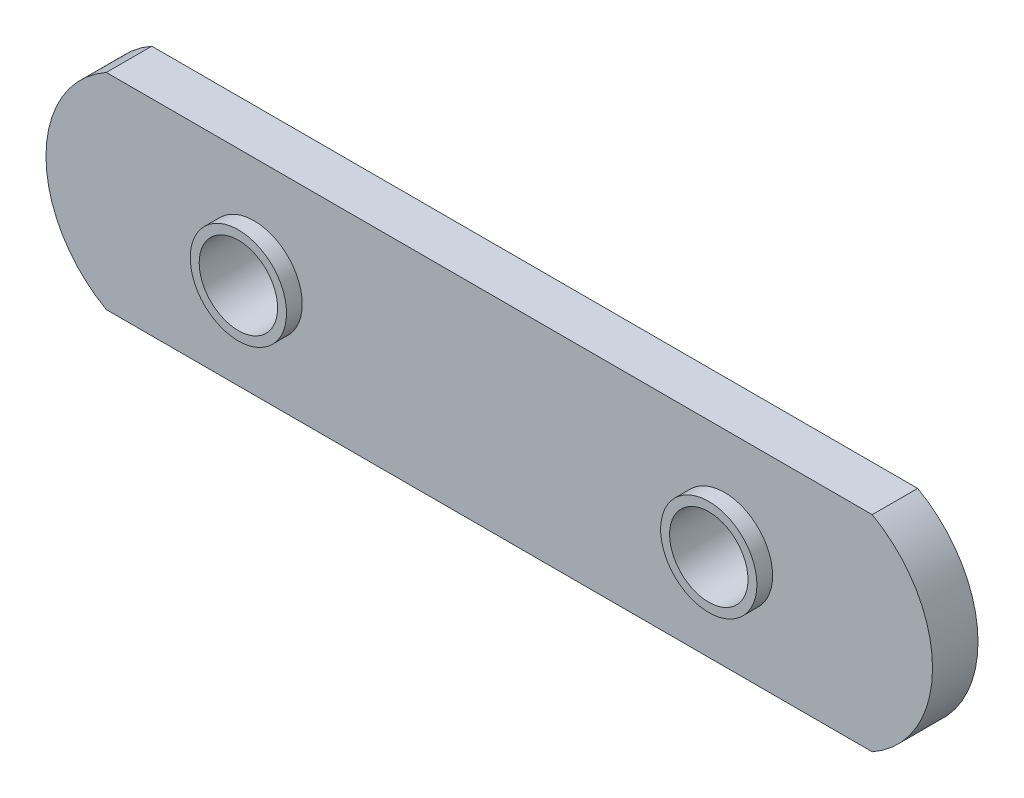
ISO-10303-21;
HEADER;
FILE_DESCRIPTION(('STEP AP214'),'2;1');
FILE_NAME('part.step','',(''),(''),'','','');
FILE_SCHEMA(('AUTOMOTIVE_DESIGN { 1 0 10303 214 1 1 1 1 }'));
ENDSEC;
DATA;
#1=APPLICATION_CONTEXT('core data for automotive mechanical design processes');
#2=APPLICATION_PROTOCOL_DEFINITION('international standard','automotive_design',2000,#1);
#3=PRODUCT_CONTEXT('',#1,'mechanical');
#4=PRODUCT('Part','Part','',(#3));
#5=PRODUCT_RELATED_PRODUCT_CATEGORY('part','',(#4));
#6=PRODUCT_DEFINITION_FORMATION('','',#4);
#7=PRODUCT_DEFINITION_CONTEXT('part definition',#1,'design');
#8=PRODUCT_DEFINITION('design','',#6,#7);
#9=PRODUCT_DEFINITION_SHAPE('','',#8);
#10=(LENGTH_UNIT() NAMED_UNIT(*) SI_UNIT(.MILLI.,.METRE.));
#11=(NAMED_UNIT(*) PLANE_ANGLE_UNIT() SI_UNIT($,.RADIAN.));
#12=(NAMED_UNIT(*) SI_UNIT($,.STERADIAN.) SOLID_ANGLE_UNIT());
#13=UNCERTAINTY_MEASURE_WITH_UNIT(LENGTH_MEASURE(1.E-05),#10,'distance_accuracy_value','');
#14=(GEOMETRIC_REPRESENTATION_CONTEXT(3) GLOBAL_UNCERTAINTY_ASSIGNED_CONTEXT((#13)) GLOBAL_UNIT_ASSIGNED_CONTEXT((#10,
#11,#12)) REPRESENTATION_CONTEXT('',''));
#15=CARTESIAN_POINT('',(0.,0.,0.));
#16=DIRECTION('',(0.,0.,1.));
#17=DIRECTION('',(1.,0.,0.));
#18=AXIS2_PLACEMENT_3D('',#15,#16,#17);
#19=CARTESIAN_POINT('',(-26.3779,0.,1.8415));
#20=DIRECTION('',(0.,0.,1.));
#21=DIRECTION('',(1.,0.,0.));
#22=AXIS2_PLACEMENT_3D('',#19,#20,#21);
#23=PLANE('',#22);
#24=CARTESIAN_POINT('',(19.05,0.,1.8415));
#25=DIRECTION('',(0.,0.,1.));
#26=DIRECTION('',(1.,0.,0.));
#27=AXIS2_PLACEMENT_3D('',#24,#25,#26);
#28=CIRCLE('',#27,3.8989);
#29=CARTESIAN_POINT('',(22.9489,0.,1.8415));
#30=VERTEX_POINT('',#29);
#31=EDGE_CURVE('E117',#30,#30,#28,.T.);
#32=ORIENTED_EDGE('',*,*,#31,.F.);
#33=EDGE_LOOP('',(#32));
#34=FACE_BOUND('',#33,.T.);
#35=CARTESIAN_POINT('',(-26.3779,0.,1.8415));
#36=DIRECTION('',(0.,0.,1.));
#37=DIRECTION('',(1.,0.,0.));
#38=AXIS2_PLACEMENT_3D('',#35,#36,#37);
#39=CIRCLE('',#38,9.525);
#40=CARTESIAN_POINT('',(-31.0177472765814,8.31849999999999,1.8415));
#41=VERTEX_POINT('',#40);
#42=CARTESIAN_POINT('',(-31.0177472765814,-8.31850000000001,1.8415));
#43=VERTEX_POINT('',#42);
#44=EDGE_CURVE('E90',#41,#43,#39,.T.);
#45=ORIENTED_EDGE('',*,*,#44,.T.);
#46=DIRECTION('',(1.,0.,0.));
#47=VECTOR('',#46,1.);
#48=CARTESIAN_POINT('',(31.0177472765814,-8.31850000000001,1.8415));
#49=LINE('',#48,#47);
#50=CARTESIAN_POINT('',(31.0177472765814,-8.31850000000001,1.8415));
#51=VERTEX_POINT('',#50);
#52=EDGE_CURVE('E85',#43,#51,#49,.T.);
#53=ORIENTED_EDGE('',*,*,#52,.T.);
#54=CARTESIAN_POINT('',(26.3779,0.,1.8415));
#55=DIRECTION('',(0.,0.,1.));
#56=DIRECTION('',(1.,0.,0.));
#57=AXIS2_PLACEMENT_3D('',#54,#55,#56);
#58=CIRCLE('',#57,9.525);
#59=CARTESIAN_POINT('',(31.0177472765814,8.31849999999999,1.8415));
#60=VERTEX_POINT('',#59);
#61=EDGE_CURVE('E88',#51,#60,#58,.T.);
#62=ORIENTED_EDGE('',*,*,#61,.T.);
#63=DIRECTION('',(-1.,0.,0.));
#64=VECTOR('',#63,1.);
#65=CARTESIAN_POINT('',(-31.0177472765814,8.31849999999999,1.8415));
#66=LINE('',#65,#64);
#67=EDGE_CURVE('E55',#60,#41,#66,.T.);
#68=ORIENTED_EDGE('',*,*,#67,.T.);
#69=EDGE_LOOP('',(#45,#53,#62,#68));
#70=FACE_BOUND('',#69,.T.);
#71=CARTESIAN_POINT('',(-19.05,0.,1.8415));
#72=DIRECTION('',(0.,0.,1.));
#73=DIRECTION('',(1.,0.,0.));
#74=AXIS2_PLACEMENT_3D('',#71,#72,#73);
#75=CIRCLE('',#74,3.8989);
#76=CARTESIAN_POINT('',(-15.1511,0.,1.8415));
#77=VERTEX_POINT('',#76);
#78=EDGE_CURVE('E123',#77,#77,#75,.T.);
#79=ORIENTED_EDGE('',*,*,#78,.F.);
#80=EDGE_LOOP('',(#79));
#81=FACE_BOUND('',#80,.T.);
#82=ADVANCED_FACE('F37',(#34,#70,#81),#23,.T.);
#83=CARTESIAN_POINT('',(-26.3779,0.,1.8415));
#84=DIRECTION('',(0.,0.,-1.));
#85=DIRECTION('',(-1.,0.,0.));
#86=AXIS2_PLACEMENT_3D('',#83,#84,#85);
#87=CYLINDRICAL_SURFACE('',#86,9.525);
#88=CARTESIAN_POINT('',(-26.3779,0.,-1.8415));
#89=DIRECTION('',(0.,0.,1.));
#90=DIRECTION('',(1.,0.,0.));
#91=AXIS2_PLACEMENT_3D('',#88,#89,#90);
#92=CIRCLE('',#91,9.525);
#93=CARTESIAN_POINT('',(-31.0177472765814,8.31849999999999,-1.8415));
#94=VERTEX_POINT('',#93);
#95=CARTESIAN_POINT('',(-31.0177472765814,-8.31850000000001,-1.8415));
#96=VERTEX_POINT('',#95);
#97=EDGE_CURVE('E103',#94,#96,#92,.T.);
#98=ORIENTED_EDGE('',*,*,#97,.T.);
#99=DIRECTION('',(0.,0.,-1.));
#100=VECTOR('',#99,1.);
#101=CARTESIAN_POINT('',(-31.0177472765814,-8.31850000000001,1.8415));
#102=LINE('',#101,#100);
#103=EDGE_CURVE('E11',#43,#96,#102,.T.);
#104=ORIENTED_EDGE('',*,*,#103,.F.);
#105=ORIENTED_EDGE('',*,*,#44,.F.);
#106=DIRECTION('',(0.,0.,-1.));
#107=VECTOR('',#106,1.);
#108=CARTESIAN_POINT('',(-31.0177472765814,8.31849999999999,1.8415));
#109=LINE('',#108,#107);
#110=EDGE_CURVE('E99',#41,#94,#109,.T.);
#111=ORIENTED_EDGE('',*,*,#110,.T.);
#112=EDGE_LOOP('',(#98,#104,#105,#111));
#113=FACE_BOUND('',#112,.T.);
#114=ADVANCED_FACE('F39',(#113),#87,.T.);
#115=CARTESIAN_POINT('',(31.0177472765814,-8.31850000000001,1.8415));
#116=DIRECTION('',(0.,1.,0.));
#117=DIRECTION('',(0.,0.,1.));
#118=AXIS2_PLACEMENT_3D('',#115,#116,#117);
#119=PLANE('',#118);
#120=DIRECTION('',(1.,0.,0.));
#121=VECTOR('',#120,1.);
#122=CARTESIAN_POINT('',(31.0177472765814,-8.31850000000001,-1.8415));
#123=LINE('',#122,#121);
#124=CARTESIAN_POINT('',(31.0177472765814,-8.31850000000001,-1.8415));
#125=VERTEX_POINT('',#124);
#126=EDGE_CURVE('E94',#96,#125,#123,.T.);
#127=ORIENTED_EDGE('',*,*,#126,.T.);
#128=DIRECTION('',(0.,0.,-1.));
#129=VECTOR('',#128,1.);
#130=CARTESIAN_POINT('',(31.0177472765814,-8.31850000000001,1.8415));
#131=LINE('',#130,#129);
#132=EDGE_CURVE('E47',#51,#125,#131,.T.);
#133=ORIENTED_EDGE('',*,*,#132,.F.);
#134=ORIENTED_EDGE('',*,*,#52,.F.);
#135=ORIENTED_EDGE('',*,*,#103,.T.);
#136=EDGE_LOOP('',(#127,#133,#134,#135));
#137=FACE_BOUND('',#136,.T.);
#138=ADVANCED_FACE('F93',(#137),#119,.F.);
#139=CARTESIAN_POINT('',(26.3779,0.,1.8415));
#140=DIRECTION('',(0.,0.,-1.));
#141=DIRECTION('',(-1.,0.,0.));
#142=AXIS2_PLACEMENT_3D('',#139,#140,#141);
#143=CYLINDRICAL_SURFACE('',#142,9.525);
#144=CARTESIAN_POINT('',(26.3779,0.,-1.8415));
#145=DIRECTION('',(0.,0.,1.));
#146=DIRECTION('',(1.,0.,0.));
#147=AXIS2_PLACEMENT_3D('',#144,#145,#146);
#148=CIRCLE('',#147,9.525);
#149=CARTESIAN_POINT('',(31.0177472765814,8.31849999999999,-1.8415));
#150=VERTEX_POINT('',#149);
#151=EDGE_CURVE('E72',#125,#150,#148,.T.);
#152=ORIENTED_EDGE('',*,*,#151,.T.);
#153=DIRECTION('',(0.,0.,-1.));
#154=VECTOR('',#153,1.);
#155=CARTESIAN_POINT('',(31.0177472765814,8.31849999999999,1.8415));
#156=LINE('',#155,#154);
#157=EDGE_CURVE('E95',#60,#150,#156,.T.);
#158=ORIENTED_EDGE('',*,*,#157,.F.);
#159=ORIENTED_EDGE('',*,*,#61,.F.);
#160=ORIENTED_EDGE('',*,*,#132,.T.);
#161=EDGE_LOOP('',(#152,#158,#159,#160));
#162=FACE_BOUND('',#161,.T.);
#163=ADVANCED_FACE('F97',(#162),#143,.T.);
#164=CARTESIAN_POINT('',(-31.0177472765814,8.31849999999999,1.8415));
#165=DIRECTION('',(0.,-1.,0.));
#166=DIRECTION('',(0.,0.,-1.));
#167=AXIS2_PLACEMENT_3D('',#164,#165,#166);
#168=PLANE('',#167);
#169=DIRECTION('',(-1.,0.,0.));
#170=VECTOR('',#169,1.);
#171=CARTESIAN_POINT('',(-31.0177472765814,8.31849999999999,-1.8415));
#172=LINE('',#171,#170);
#173=EDGE_CURVE('E78',#150,#94,#172,.T.);
#174=ORIENTED_EDGE('',*,*,#173,.T.);
#175=ORIENTED_EDGE('',*,*,#110,.F.);
#176=ORIENTED_EDGE('',*,*,#67,.F.);
#177=ORIENTED_EDGE('',*,*,#157,.T.);
#178=EDGE_LOOP('',(#174,#175,#176,#177));
#179=FACE_BOUND('',#178,.T.);
#180=ADVANCED_FACE('F111',(#179),#168,.F.);
#181=CARTESIAN_POINT('',(-26.3779,0.,-1.8415));
#182=DIRECTION('',(0.,0.,1.));
#183=DIRECTION('',(1.,0.,0.));
#184=AXIS2_PLACEMENT_3D('',#181,#182,#183);
#185=PLANE('',#184);
#186=CARTESIAN_POINT('',(-19.05,0.,-1.8415));
#187=DIRECTION('',(0.,0.,-1.));
#188=DIRECTION('',(-1.,0.,0.));
#189=AXIS2_PLACEMENT_3D('',#186,#187,#188);
#190=CIRCLE('',#189,3.175);
#191=CARTESIAN_POINT('',(-22.225,0.,-1.8415));
#192=VERTEX_POINT('',#191);
#193=EDGE_CURVE('E134',#192,#192,#190,.T.);
#194=ORIENTED_EDGE('',*,*,#193,.F.);
#195=EDGE_LOOP('',(#194));
#196=FACE_BOUND('',#195,.T.);
#197=CARTESIAN_POINT('',(19.05,0.,-1.8415));
#198=DIRECTION('',(0.,0.,-1.));
#199=DIRECTION('',(-1.,0.,0.));
#200=AXIS2_PLACEMENT_3D('',#197,#198,#199);
#201=CIRCLE('',#200,3.175);
#202=CARTESIAN_POINT('',(15.875,0.,-1.8415));
#203=VERTEX_POINT('',#202);
#204=EDGE_CURVE('E128',#203,#203,#201,.T.);
#205=ORIENTED_EDGE('',*,*,#204,.F.);
#206=EDGE_LOOP('',(#205));
#207=FACE_BOUND('',#206,.T.);
#208=ORIENTED_EDGE('',*,*,#97,.F.);
#209=ORIENTED_EDGE('',*,*,#173,.F.);
#210=ORIENTED_EDGE('',*,*,#151,.F.);
#211=ORIENTED_EDGE('',*,*,#126,.F.);
#212=EDGE_LOOP('',(#208,#209,#210,#211));
#213=FACE_BOUND('',#212,.T.);
#214=ADVANCED_FACE('F114',(#196,#207,#213),#185,.F.);
#215=CARTESIAN_POINT('',(19.05,0.,3.1115));
#216=DIRECTION('',(0.,0.,-1.));
#217=DIRECTION('',(-1.,0.,0.));
#218=AXIS2_PLACEMENT_3D('',#215,#216,#217);
#219=CYLINDRICAL_SURFACE('',#218,3.8989);
#220=CARTESIAN_POINT('',(19.05,0.,3.1115));
#221=DIRECTION('',(0.,0.,1.));
#222=DIRECTION('',(1.,0.,0.));
#223=AXIS2_PLACEMENT_3D('',#220,#221,#222);
#224=CIRCLE('',#223,3.8989);
#225=CARTESIAN_POINT('',(22.9489,0.,3.1115));
#226=VERTEX_POINT('',#225);
#227=EDGE_CURVE('E106',#226,#226,#224,.T.);
#228=ORIENTED_EDGE('',*,*,#227,.F.);
#229=EDGE_LOOP('',(#228));
#230=FACE_BOUND('',#229,.T.);
#231=ORIENTED_EDGE('',*,*,#31,.T.);
#232=EDGE_LOOP('',(#231));
#233=FACE_BOUND('',#232,.T.);
#234=ADVANCED_FACE('F142',(#230,#233),#219,.T.);
#235=CARTESIAN_POINT('',(19.05,0.,3.1115));
#236=DIRECTION('',(0.,0.,1.));
#237=DIRECTION('',(1.,0.,0.));
#238=AXIS2_PLACEMENT_3D('',#235,#236,#237);
#239=PLANE('',#238);
#240=CARTESIAN_POINT('',(19.05,0.,3.1115));
#241=DIRECTION('',(0.,0.,1.));
#242=DIRECTION('',(1.,0.,0.));
#243=AXIS2_PLACEMENT_3D('',#240,#241,#242);
#244=CIRCLE('',#243,3.175);
#245=CARTESIAN_POINT('',(22.225,0.,3.1115));
#246=VERTEX_POINT('',#245);
#247=EDGE_CURVE('E41',#246,#246,#244,.T.);
#248=ORIENTED_EDGE('',*,*,#247,.F.);
#249=EDGE_LOOP('',(#248));
#250=FACE_BOUND('',#249,.T.);
#251=ORIENTED_EDGE('',*,*,#227,.T.);
#252=EDGE_LOOP('',(#251));
#253=FACE_BOUND('',#252,.T.);
#254=ADVANCED_FACE('F202',(#250,#253),#239,.T.);
#255=CARTESIAN_POINT('',(-19.05,0.,3.1115));
#256=DIRECTION('',(0.,0.,-1.));
#257=DIRECTION('',(-1.,0.,0.));
#258=AXIS2_PLACEMENT_3D('',#255,#256,#257);
#259=CYLINDRICAL_SURFACE('',#258,3.8989);
#260=CARTESIAN_POINT('',(-19.05,0.,3.1115));
#261=DIRECTION('',(0.,0.,1.));
#262=DIRECTION('',(1.,0.,0.));
#263=AXIS2_PLACEMENT_3D('',#260,#261,#262);
#264=CIRCLE('',#263,3.8989);
#265=CARTESIAN_POINT('',(-15.1511,0.,3.1115));
#266=VERTEX_POINT('',#265);
#267=EDGE_CURVE('E120',#266,#266,#264,.T.);
#268=ORIENTED_EDGE('',*,*,#267,.F.);
#269=EDGE_LOOP('',(#268));
#270=FACE_BOUND('',#269,.T.);
#271=ORIENTED_EDGE('',*,*,#78,.T.);
#272=EDGE_LOOP('',(#271));
#273=FACE_BOUND('',#272,.T.);
#274=ADVANCED_FACE('F157',(#270,#273),#259,.T.);
#275=CARTESIAN_POINT('',(-19.05,0.,3.1115));
#276=DIRECTION('',(0.,0.,1.));
#277=DIRECTION('',(1.,0.,0.));
#278=AXIS2_PLACEMENT_3D('',#275,#276,#277);
#279=PLANE('',#278);
#280=CARTESIAN_POINT('',(-19.05,0.,3.1115));
#281=DIRECTION('',(0.,0.,1.));
#282=DIRECTION('',(1.,0.,0.));
#283=AXIS2_PLACEMENT_3D('',#280,#281,#282);
#284=CIRCLE('',#283,3.175);
#285=CARTESIAN_POINT('',(-15.875,0.,3.1115));
#286=VERTEX_POINT('',#285);
#287=EDGE_CURVE('E131',#286,#286,#284,.T.);
#288=ORIENTED_EDGE('',*,*,#287,.F.);
#289=EDGE_LOOP('',(#288));
#290=FACE_BOUND('',#289,.T.);
#291=ORIENTED_EDGE('',*,*,#267,.T.);
#292=EDGE_LOOP('',(#291));
#293=FACE_BOUND('',#292,.T.);
#294=ADVANCED_FACE('F148',(#290,#293),#279,.T.);
#295=CARTESIAN_POINT('',(19.05,0.,-1.8415));
#296=DIRECTION('',(0.,0.,-1.));
#297=DIRECTION('',(-1.,0.,0.));
#298=AXIS2_PLACEMENT_3D('',#295,#296,#297);
#299=CYLINDRICAL_SURFACE('',#298,3.175);
#300=ORIENTED_EDGE('',*,*,#247,.T.);
#301=EDGE_LOOP('',(#300));
#302=FACE_BOUND('',#301,.T.);
#303=ORIENTED_EDGE('',*,*,#204,.T.);
#304=EDGE_LOOP('',(#303));
#305=FACE_BOUND('',#304,.T.);
#306=ADVANCED_FACE('F146',(#302,#305),#299,.F.);
#307=CARTESIAN_POINT('',(-19.05,0.,-1.8415));
#308=DIRECTION('',(0.,0.,-1.));
#309=DIRECTION('',(-1.,0.,0.));
#310=AXIS2_PLACEMENT_3D('',#307,#308,#309);
#311=CYLINDRICAL_SURFACE('',#310,3.175);
#312=ORIENTED_EDGE('',*,*,#287,.T.);
#313=EDGE_LOOP('',(#312));
#314=FACE_BOUND('',#313,.T.);
#315=ORIENTED_EDGE('',*,*,#193,.T.);
#316=EDGE_LOOP('',(#315));
#317=FACE_BOUND('',#316,.T.);
#318=ADVANCED_FACE('F138',(#314,#317),#311,.F.);
#319=CLOSED_SHELL('',(#82,#114,#138,#163,#180,#214,#234,#254,#274,#294,#306,#318));
#320=MANIFOLD_SOLID_BREP('B2',#319);
#321=ADVANCED_BREP_SHAPE_REPRESENTATION('',(#18,#320),#14);
#322=SHAPE_DEFINITION_REPRESENTATION(#9,#321);
ENDSEC;
END-ISO-10303-21;
